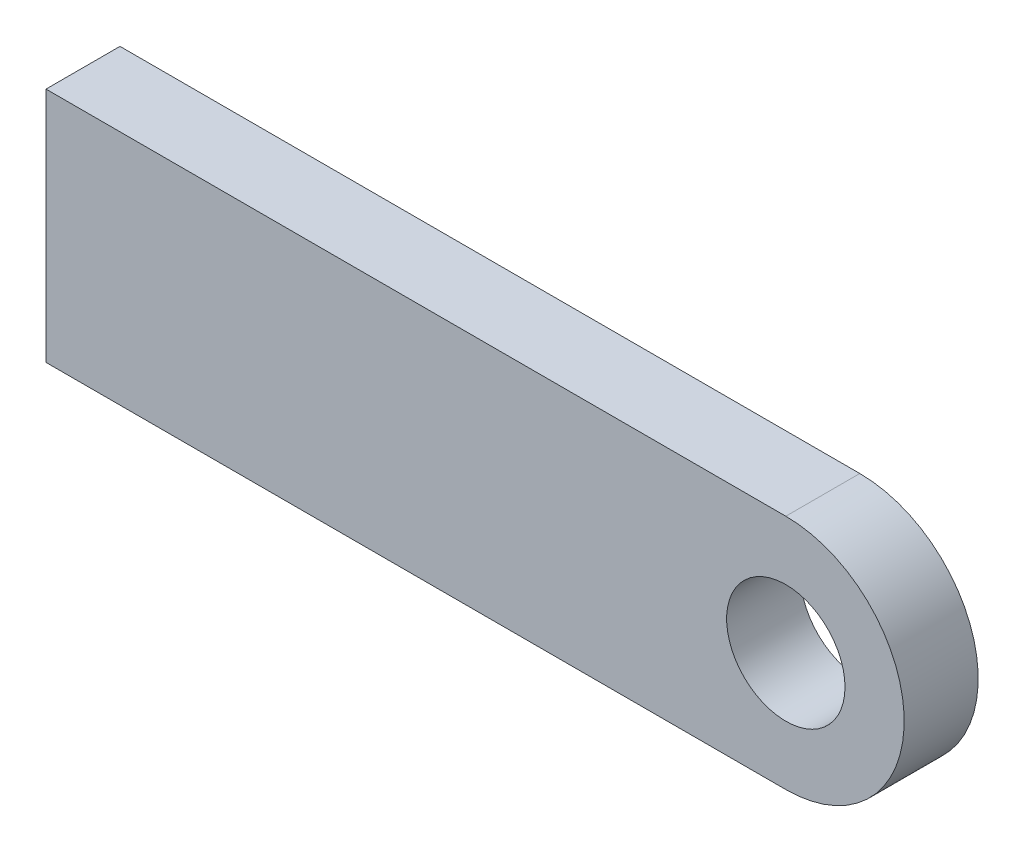
ISO-10303-21;
HEADER;
FILE_DESCRIPTION(('STEP AP214'),'2;1');
FILE_NAME('part.step','',(''),(''),'','','');
FILE_SCHEMA(('AUTOMOTIVE_DESIGN { 1 0 10303 214 1 1 1 1 }'));
ENDSEC;
DATA;
#1=APPLICATION_CONTEXT('core data for automotive mechanical design processes');
#2=APPLICATION_PROTOCOL_DEFINITION('international standard','automotive_design',2000,#1);
#3=PRODUCT_CONTEXT('',#1,'mechanical');
#4=PRODUCT('Part','Part','',(#3));
#5=PRODUCT_RELATED_PRODUCT_CATEGORY('part','',(#4));
#6=PRODUCT_DEFINITION_FORMATION('','',#4);
#7=PRODUCT_DEFINITION_CONTEXT('part definition',#1,'design');
#8=PRODUCT_DEFINITION('design','',#6,#7);
#9=PRODUCT_DEFINITION_SHAPE('','',#8);
#10=(LENGTH_UNIT() NAMED_UNIT(*) SI_UNIT(.MILLI.,.METRE.));
#11=(NAMED_UNIT(*) PLANE_ANGLE_UNIT() SI_UNIT($,.RADIAN.));
#12=(NAMED_UNIT(*) SI_UNIT($,.STERADIAN.) SOLID_ANGLE_UNIT());
#13=UNCERTAINTY_MEASURE_WITH_UNIT(LENGTH_MEASURE(1.E-05),#10,'distance_accuracy_value','');
#14=(GEOMETRIC_REPRESENTATION_CONTEXT(3) GLOBAL_UNCERTAINTY_ASSIGNED_CONTEXT((#13)) GLOBAL_UNIT_ASSIGNED_CONTEXT((#10,
#11,#12)) REPRESENTATION_CONTEXT('',''));
#15=CARTESIAN_POINT('',(0.,0.,0.));
#16=DIRECTION('',(0.,0.,1.));
#17=DIRECTION('',(1.,0.,0.));
#18=AXIS2_PLACEMENT_3D('',#15,#16,#17);
#19=CARTESIAN_POINT('',(50.,0.,5.));
#20=DIRECTION('',(0.,0.,1.));
#21=DIRECTION('',(1.,0.,0.));
#22=AXIS2_PLACEMENT_3D('',#19,#20,#21);
#23=PLANE('',#22);
#24=DIRECTION('',(0.,-1.,0.));
#25=VECTOR('',#24,1.);
#26=CARTESIAN_POINT('',(0.,8.00000000000002,5.));
#27=LINE('',#26,#25);
#28=CARTESIAN_POINT('',(0.,8.00000000000002,5.));
#29=VERTEX_POINT('',#28);
#30=CARTESIAN_POINT('',(0.,-8.00000000000001,5.));
#31=VERTEX_POINT('',#30);
#32=EDGE_CURVE('E118',#29,#31,#27,.T.);
#33=ORIENTED_EDGE('',*,*,#32,.T.);
#34=DIRECTION('',(1.,0.,0.));
#35=VECTOR('',#34,1.);
#36=CARTESIAN_POINT('',(-50.,-8.00000000000001,5.));
#37=LINE('',#36,#35);
#38=CARTESIAN_POINT('',(50.,-8.00000000000001,5.));
#39=VERTEX_POINT('',#38);
#40=EDGE_CURVE('E69',#31,#39,#37,.T.);
#41=ORIENTED_EDGE('',*,*,#40,.T.);
#42=CARTESIAN_POINT('',(50.,0.,5.));
#43=DIRECTION('',(0.,0.,1.));
#44=DIRECTION('',(1.,0.,0.));
#45=AXIS2_PLACEMENT_3D('',#42,#43,#44);
#46=CIRCLE('',#45,8.00000000000001);
#47=CARTESIAN_POINT('',(50.,8.00000000000002,5.));
#48=VERTEX_POINT('',#47);
#49=EDGE_CURVE('E89',#39,#48,#46,.T.);
#50=ORIENTED_EDGE('',*,*,#49,.T.);
#51=DIRECTION('',(-1.,0.,0.));
#52=VECTOR('',#51,1.);
#53=CARTESIAN_POINT('',(-50.,7.99999999999999,5.));
#54=LINE('',#53,#52);
#55=EDGE_CURVE('E107',#48,#29,#54,.T.);
#56=ORIENTED_EDGE('',*,*,#55,.T.);
#57=EDGE_LOOP('',(#33,#41,#50,#56));
#58=FACE_BOUND('',#57,.T.);
#59=CARTESIAN_POINT('',(50.,0.,5.));
#60=DIRECTION('',(0.,0.,1.));
#61=DIRECTION('',(1.,0.,0.));
#62=AXIS2_PLACEMENT_3D('',#59,#60,#61);
#63=CIRCLE('',#62,4.00000000000001);
#64=CARTESIAN_POINT('',(54.,0.,5.));
#65=VERTEX_POINT('',#64);
#66=EDGE_CURVE('E99',#65,#65,#63,.T.);
#67=ORIENTED_EDGE('',*,*,#66,.F.);
#68=EDGE_LOOP('',(#67));
#69=FACE_BOUND('',#68,.T.);
#70=ADVANCED_FACE('F45',(#58,#69),#23,.T.);
#71=CARTESIAN_POINT('',(50.,0.,0.));
#72=DIRECTION('',(0.,0.,1.));
#73=DIRECTION('',(1.,0.,0.));
#74=AXIS2_PLACEMENT_3D('',#71,#72,#73);
#75=PLANE('',#74);
#76=DIRECTION('',(1.,0.,0.));
#77=VECTOR('',#76,1.);
#78=CARTESIAN_POINT('',(-50.,-8.00000000000001,0.));
#79=LINE('',#78,#77);
#80=CARTESIAN_POINT('',(0.,-8.00000000000001,0.));
#81=VERTEX_POINT('',#80);
#82=CARTESIAN_POINT('',(50.,-8.00000000000001,0.));
#83=VERTEX_POINT('',#82);
#84=EDGE_CURVE('E82',#81,#83,#79,.T.);
#85=ORIENTED_EDGE('',*,*,#84,.F.);
#86=DIRECTION('',(0.,1.,0.));
#87=VECTOR('',#86,1.);
#88=CARTESIAN_POINT('',(0.,8.00000000000002,0.));
#89=LINE('',#88,#87);
#90=CARTESIAN_POINT('',(0.,8.00000000000002,0.));
#91=VERTEX_POINT('',#90);
#92=EDGE_CURVE('E60',#81,#91,#89,.T.);
#93=ORIENTED_EDGE('',*,*,#92,.T.);
#94=DIRECTION('',(-1.,0.,0.));
#95=VECTOR('',#94,1.);
#96=CARTESIAN_POINT('',(-50.,7.99999999999999,0.));
#97=LINE('',#96,#95);
#98=CARTESIAN_POINT('',(50.,8.00000000000002,0.));
#99=VERTEX_POINT('',#98);
#100=EDGE_CURVE('E90',#99,#91,#97,.T.);
#101=ORIENTED_EDGE('',*,*,#100,.F.);
#102=CARTESIAN_POINT('',(50.,0.,0.));
#103=DIRECTION('',(0.,0.,1.));
#104=DIRECTION('',(1.,0.,0.));
#105=AXIS2_PLACEMENT_3D('',#102,#103,#104);
#106=CIRCLE('',#105,8.00000000000001);
#107=EDGE_CURVE('E95',#83,#99,#106,.T.);
#108=ORIENTED_EDGE('',*,*,#107,.F.);
#109=EDGE_LOOP('',(#85,#93,#101,#108));
#110=FACE_BOUND('',#109,.T.);
#111=CARTESIAN_POINT('',(50.,0.,0.));
#112=DIRECTION('',(0.,0.,1.));
#113=DIRECTION('',(1.,0.,0.));
#114=AXIS2_PLACEMENT_3D('',#111,#112,#113);
#115=CIRCLE('',#114,4.00000000000001);
#116=CARTESIAN_POINT('',(54.,0.,0.));
#117=VERTEX_POINT('',#116);
#118=EDGE_CURVE('E103',#117,#117,#115,.T.);
#119=ORIENTED_EDGE('',*,*,#118,.T.);
#120=EDGE_LOOP('',(#119));
#121=FACE_BOUND('',#120,.T.);
#122=ADVANCED_FACE('F96',(#110,#121),#75,.F.);
#123=CARTESIAN_POINT('',(50.,0.,5.));
#124=DIRECTION('',(0.,0.,-1.));
#125=DIRECTION('',(-1.,0.,0.));
#126=AXIS2_PLACEMENT_3D('',#123,#124,#125);
#127=CYLINDRICAL_SURFACE('',#126,8.00000000000001);
#128=ORIENTED_EDGE('',*,*,#107,.T.);
#129=DIRECTION('',(0.,0.,-1.));
#130=VECTOR('',#129,1.);
#131=CARTESIAN_POINT('',(50.,8.00000000000002,5.));
#132=LINE('',#131,#130);
#133=EDGE_CURVE('E13',#48,#99,#132,.T.);
#134=ORIENTED_EDGE('',*,*,#133,.F.);
#135=ORIENTED_EDGE('',*,*,#49,.F.);
#136=DIRECTION('',(0.,0.,-1.));
#137=VECTOR('',#136,1.);
#138=CARTESIAN_POINT('',(50.,-8.00000000000001,5.));
#139=LINE('',#138,#137);
#140=EDGE_CURVE('E53',#39,#83,#139,.T.);
#141=ORIENTED_EDGE('',*,*,#140,.T.);
#142=EDGE_LOOP('',(#128,#134,#135,#141));
#143=FACE_BOUND('',#142,.T.);
#144=ADVANCED_FACE('F47',(#143),#127,.T.);
#145=CARTESIAN_POINT('',(-50.,7.99999999999999,5.));
#146=DIRECTION('',(0.,-1.,0.));
#147=DIRECTION('',(1.,0.,0.));
#148=AXIS2_PLACEMENT_3D('',#145,#146,#147);
#149=PLANE('',#148);
#150=ORIENTED_EDGE('',*,*,#100,.T.);
#151=DIRECTION('',(0.,0.,1.));
#152=VECTOR('',#151,1.);
#153=CARTESIAN_POINT('',(0.,8.00000000000002,5.));
#154=LINE('',#153,#152);
#155=EDGE_CURVE('E112',#91,#29,#154,.T.);
#156=ORIENTED_EDGE('',*,*,#155,.T.);
#157=ORIENTED_EDGE('',*,*,#55,.F.);
#158=ORIENTED_EDGE('',*,*,#133,.T.);
#159=EDGE_LOOP('',(#150,#156,#157,#158));
#160=FACE_BOUND('',#159,.T.);
#161=ADVANCED_FACE('F143',(#160),#149,.F.);
#162=CARTESIAN_POINT('',(-50.,-8.00000000000001,5.));
#163=DIRECTION('',(0.,1.,0.));
#164=DIRECTION('',(0.,0.,1.));
#165=AXIS2_PLACEMENT_3D('',#162,#163,#164);
#166=PLANE('',#165);
#167=ORIENTED_EDGE('',*,*,#40,.F.);
#168=DIRECTION('',(0.,0.,-1.));
#169=VECTOR('',#168,1.);
#170=CARTESIAN_POINT('',(0.,-8.00000000000001,5.));
#171=LINE('',#170,#169);
#172=EDGE_CURVE('E86',#31,#81,#171,.T.);
#173=ORIENTED_EDGE('',*,*,#172,.T.);
#174=ORIENTED_EDGE('',*,*,#84,.T.);
#175=ORIENTED_EDGE('',*,*,#140,.F.);
#176=EDGE_LOOP('',(#167,#173,#174,#175));
#177=FACE_BOUND('',#176,.T.);
#178=ADVANCED_FACE('F84',(#177),#166,.F.);
#179=CARTESIAN_POINT('',(50.,0.,5.));
#180=DIRECTION('',(0.,0.,-1.));
#181=DIRECTION('',(-1.,0.,0.));
#182=AXIS2_PLACEMENT_3D('',#179,#180,#181);
#183=CYLINDRICAL_SURFACE('',#182,4.00000000000001);
#184=ORIENTED_EDGE('',*,*,#66,.T.);
#185=EDGE_LOOP('',(#184));
#186=FACE_BOUND('',#185,.T.);
#187=ORIENTED_EDGE('',*,*,#118,.F.);
#188=EDGE_LOOP('',(#187));
#189=FACE_BOUND('',#188,.T.);
#190=ADVANCED_FACE('F137',(#186,#189),#183,.F.);
#191=CARTESIAN_POINT('',(0.,0.,0.));
#192=DIRECTION('',(1.,0.,0.));
#193=DIRECTION('',(0.,0.,-1.));
#194=AXIS2_PLACEMENT_3D('',#191,#192,#193);
#195=PLANE('',#194);
#196=CARTESIAN_POINT('',(0.,0.,2.5));
#197=DIRECTION('',(-1.,0.,0.));
#198=DIRECTION('',(0.,0.,1.));
#199=AXIS2_PLACEMENT_3D('',#196,#197,#198);
#200=CIRCLE('',#199,2.);
#201=CARTESIAN_POINT('',(0.,0.,4.5));
#202=VERTEX_POINT('',#201);
#203=EDGE_CURVE('E121',#202,#202,#200,.T.);
#204=ORIENTED_EDGE('',*,*,#203,.F.);
#205=EDGE_LOOP('',(#204));
#206=FACE_BOUND('',#205,.T.);
#207=ORIENTED_EDGE('',*,*,#32,.F.);
#208=ORIENTED_EDGE('',*,*,#155,.F.);
#209=ORIENTED_EDGE('',*,*,#92,.F.);
#210=ORIENTED_EDGE('',*,*,#172,.F.);
#211=EDGE_LOOP('',(#207,#208,#209,#210));
#212=FACE_BOUND('',#211,.T.);
#213=ADVANCED_FACE('F132',(#206,#212),#195,.F.);
#214=CARTESIAN_POINT('',(5.,0.,2.5));
#215=DIRECTION('',(-1.,0.,0.));
#216=DIRECTION('',(0.,0.,1.));
#217=AXIS2_PLACEMENT_3D('',#214,#215,#216);
#218=CYLINDRICAL_SURFACE('',#217,2.);
#219=CARTESIAN_POINT('',(5.,0.,2.5));
#220=DIRECTION('',(-1.,0.,0.));
#221=DIRECTION('',(0.,0.,1.));
#222=AXIS2_PLACEMENT_3D('',#219,#220,#221);
#223=CIRCLE('',#222,2.);
#224=CARTESIAN_POINT('',(5.,0.,4.5));
#225=VERTEX_POINT('',#224);
#226=EDGE_CURVE('E120',#225,#225,#223,.T.);
#227=ORIENTED_EDGE('',*,*,#226,.F.);
#228=EDGE_LOOP('',(#227));
#229=FACE_BOUND('',#228,.T.);
#230=ORIENTED_EDGE('',*,*,#203,.T.);
#231=EDGE_LOOP('',(#230));
#232=FACE_BOUND('',#231,.T.);
#233=ADVANCED_FACE('F129',(#229,#232),#218,.F.);
#234=CARTESIAN_POINT('',(5.,0.,2.5));
#235=DIRECTION('',(-1.,0.,0.));
#236=DIRECTION('',(0.,0.,1.));
#237=AXIS2_PLACEMENT_3D('',#234,#235,#236);
#238=PLANE('',#237);
#239=ORIENTED_EDGE('',*,*,#226,.T.);
#240=EDGE_LOOP('',(#239));
#241=FACE_BOUND('',#240,.T.);
#242=ADVANCED_FACE('F127',(#241),#238,.T.);
#243=CLOSED_SHELL('',(#70,#122,#144,#161,#178,#190,#213,#233,#242));
#244=MANIFOLD_SOLID_BREP('B2',#243);
#245=ADVANCED_BREP_SHAPE_REPRESENTATION('',(#18,#244),#14);
#246=SHAPE_DEFINITION_REPRESENTATION(#9,#245);
ENDSEC;
END-ISO-10303-21;
